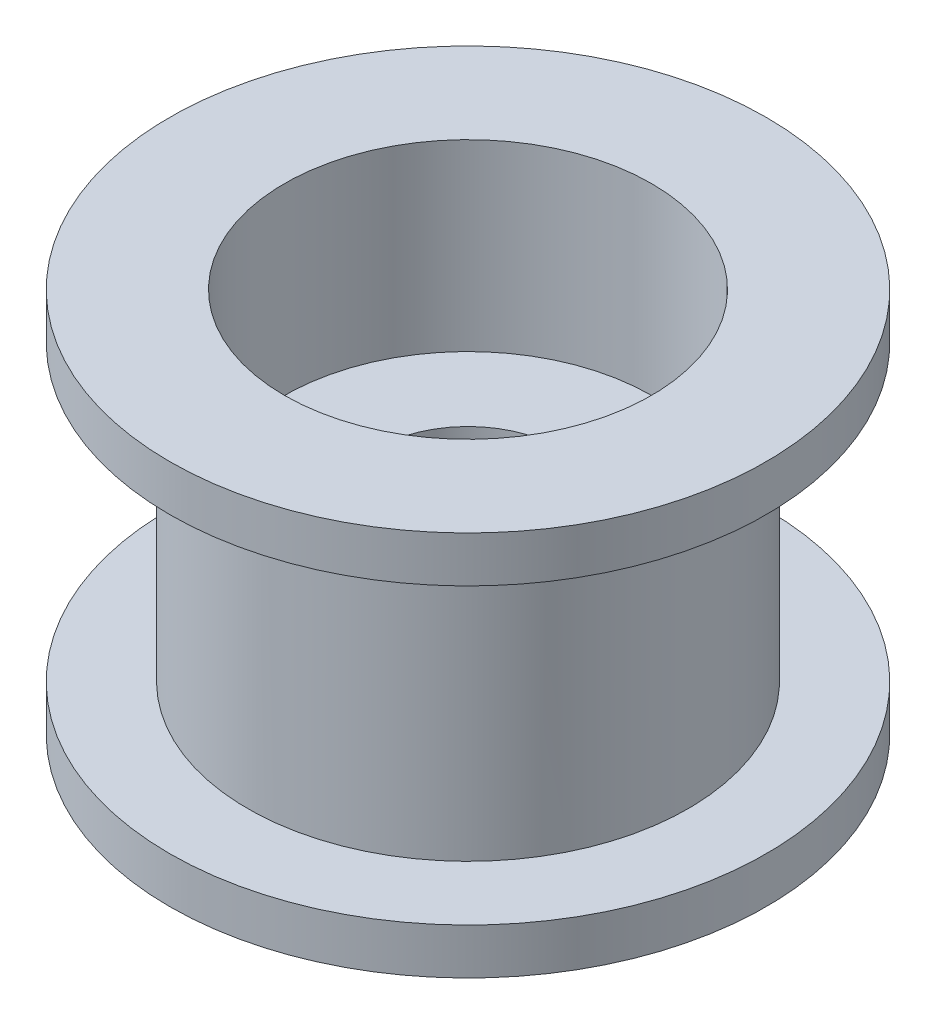
ISO-10303-21;
HEADER;
FILE_DESCRIPTION(('STEP AP214'),'2;1');
FILE_NAME('part.step','',(''),(''),'','','');
FILE_SCHEMA(('AUTOMOTIVE_DESIGN { 1 0 10303 214 1 1 1 1 }'));
ENDSEC;
DATA;
#1=APPLICATION_CONTEXT('core data for automotive mechanical design processes');
#2=APPLICATION_PROTOCOL_DEFINITION('international standard','automotive_design',2000,#1);
#3=PRODUCT_CONTEXT('',#1,'mechanical');
#4=PRODUCT('Part','Part','',(#3));
#5=PRODUCT_RELATED_PRODUCT_CATEGORY('part','',(#4));
#6=PRODUCT_DEFINITION_FORMATION('','',#4);
#7=PRODUCT_DEFINITION_CONTEXT('part definition',#1,'design');
#8=PRODUCT_DEFINITION('design','',#6,#7);
#9=PRODUCT_DEFINITION_SHAPE('','',#8);
#10=(LENGTH_UNIT() NAMED_UNIT(*) SI_UNIT(.MILLI.,.METRE.));
#11=(NAMED_UNIT(*) PLANE_ANGLE_UNIT() SI_UNIT($,.RADIAN.));
#12=(NAMED_UNIT(*) SI_UNIT($,.STERADIAN.) SOLID_ANGLE_UNIT());
#13=UNCERTAINTY_MEASURE_WITH_UNIT(LENGTH_MEASURE(1.E-05),#10,'distance_accuracy_value','');
#14=(GEOMETRIC_REPRESENTATION_CONTEXT(3) GLOBAL_UNCERTAINTY_ASSIGNED_CONTEXT((#13)) GLOBAL_UNIT_ASSIGNED_CONTEXT((#10,
#11,#12)) REPRESENTATION_CONTEXT('',''));
#15=CARTESIAN_POINT('',(0.,0.,0.));
#16=DIRECTION('',(0.,0.,1.));
#17=DIRECTION('',(1.,0.,0.));
#18=AXIS2_PLACEMENT_3D('',#15,#16,#17);
#19=CARTESIAN_POINT('',(0.,-4.2,0.));
#20=DIRECTION('',(0.,-1.,0.));
#21=DIRECTION('',(0.,0.,1.));
#22=AXIS2_PLACEMENT_3D('',#19,#20,#21);
#23=PLANE('',#22);
#24=CARTESIAN_POINT('',(0.,-4.2,0.));
#25=DIRECTION('',(0.,1.,0.));
#26=DIRECTION('',(0.,0.,1.));
#27=AXIS2_PLACEMENT_3D('',#24,#25,#26);
#28=CIRCLE('',#27,6.5);
#29=CARTESIAN_POINT('',(0.,-4.2,6.5));
#30=VERTEX_POINT('',#29);
#31=EDGE_CURVE('E58',#30,#30,#28,.T.);
#32=ORIENTED_EDGE('',*,*,#31,.F.);
#33=EDGE_LOOP('',(#32));
#34=FACE_BOUND('',#33,.T.);
#35=CARTESIAN_POINT('',(0.,-4.2,0.));
#36=DIRECTION('',(0.,1.,0.));
#37=DIRECTION('',(0.,0.,1.));
#38=AXIS2_PLACEMENT_3D('',#35,#36,#37);
#39=CIRCLE('',#38,4.);
#40=CARTESIAN_POINT('',(0.,-4.2,4.));
#41=VERTEX_POINT('',#40);
#42=EDGE_CURVE('E65',#41,#41,#39,.T.);
#43=ORIENTED_EDGE('',*,*,#42,.T.);
#44=EDGE_LOOP('',(#43));
#45=FACE_BOUND('',#44,.T.);
#46=ADVANCED_FACE('F32',(#34,#45),#23,.T.);
#47=CARTESIAN_POINT('',(0.,3.2,0.));
#48=DIRECTION('',(0.,-1.,0.));
#49=DIRECTION('',(0.,0.,-1.));
#50=AXIS2_PLACEMENT_3D('',#47,#48,#49);
#51=CYLINDRICAL_SURFACE('',#50,4.8);
#52=CARTESIAN_POINT('',(0.,3.2,0.));
#53=DIRECTION('',(0.,1.,0.));
#54=DIRECTION('',(0.,0.,1.));
#55=AXIS2_PLACEMENT_3D('',#52,#53,#54);
#56=CIRCLE('',#55,4.8);
#57=CARTESIAN_POINT('',(0.,3.2,4.8));
#58=VERTEX_POINT('',#57);
#59=EDGE_CURVE('E10',#58,#58,#56,.T.);
#60=ORIENTED_EDGE('',*,*,#59,.F.);
#61=EDGE_LOOP('',(#60));
#62=FACE_BOUND('',#61,.T.);
#63=CARTESIAN_POINT('',(0.,-3.2,0.));
#64=DIRECTION('',(0.,-1.,0.));
#65=DIRECTION('',(0.,0.,-1.));
#66=AXIS2_PLACEMENT_3D('',#63,#64,#65);
#67=CIRCLE('',#66,4.8);
#68=CARTESIAN_POINT('',(0.,-3.2,-4.8));
#69=VERTEX_POINT('',#68);
#70=EDGE_CURVE('E53',#69,#69,#67,.T.);
#71=ORIENTED_EDGE('',*,*,#70,.F.);
#72=EDGE_LOOP('',(#71));
#73=FACE_BOUND('',#72,.T.);
#74=ADVANCED_FACE('F34',(#62,#73),#51,.T.);
#75=CARTESIAN_POINT('',(0.,3.2,0.));
#76=DIRECTION('',(0.,1.,0.));
#77=DIRECTION('',(0.,0.,1.));
#78=AXIS2_PLACEMENT_3D('',#75,#76,#77);
#79=PLANE('',#78);
#80=CARTESIAN_POINT('',(0.,3.2,0.));
#81=DIRECTION('',(0.,1.,0.));
#82=DIRECTION('',(0.,0.,1.));
#83=AXIS2_PLACEMENT_3D('',#80,#81,#82);
#84=CIRCLE('',#83,6.5);
#85=CARTESIAN_POINT('',(0.,3.2,6.5));
#86=VERTEX_POINT('',#85);
#87=EDGE_CURVE('E44',#86,#86,#84,.T.);
#88=ORIENTED_EDGE('',*,*,#87,.F.);
#89=EDGE_LOOP('',(#88));
#90=FACE_BOUND('',#89,.T.);
#91=ORIENTED_EDGE('',*,*,#59,.T.);
#92=EDGE_LOOP('',(#91));
#93=FACE_BOUND('',#92,.T.);
#94=ADVANCED_FACE('F98',(#90,#93),#79,.F.);
#95=CARTESIAN_POINT('',(0.,4.2,0.));
#96=DIRECTION('',(0.,-1.,0.));
#97=DIRECTION('',(0.,0.,-1.));
#98=AXIS2_PLACEMENT_3D('',#95,#96,#97);
#99=CYLINDRICAL_SURFACE('',#98,6.5);
#100=CARTESIAN_POINT('',(0.,4.2,0.));
#101=DIRECTION('',(0.,1.,0.));
#102=DIRECTION('',(0.,0.,1.));
#103=AXIS2_PLACEMENT_3D('',#100,#101,#102);
#104=CIRCLE('',#103,6.5);
#105=CARTESIAN_POINT('',(0.,4.2,6.5));
#106=VERTEX_POINT('',#105);
#107=EDGE_CURVE('E40',#106,#106,#104,.T.);
#108=ORIENTED_EDGE('',*,*,#107,.F.);
#109=EDGE_LOOP('',(#108));
#110=FACE_BOUND('',#109,.T.);
#111=ORIENTED_EDGE('',*,*,#87,.T.);
#112=EDGE_LOOP('',(#111));
#113=FACE_BOUND('',#112,.T.);
#114=ADVANCED_FACE('F120',(#110,#113),#99,.T.);
#115=CARTESIAN_POINT('',(0.,4.2,0.));
#116=DIRECTION('',(0.,1.,0.));
#117=DIRECTION('',(0.,0.,1.));
#118=AXIS2_PLACEMENT_3D('',#115,#116,#117);
#119=PLANE('',#118);
#120=CARTESIAN_POINT('',(0.,4.2,0.));
#121=DIRECTION('',(0.,1.,0.));
#122=DIRECTION('',(0.,0.,1.));
#123=AXIS2_PLACEMENT_3D('',#120,#121,#122);
#124=CIRCLE('',#123,4.);
#125=CARTESIAN_POINT('',(0.,4.2,4.));
#126=VERTEX_POINT('',#125);
#127=EDGE_CURVE('E50',#126,#126,#124,.T.);
#128=ORIENTED_EDGE('',*,*,#127,.F.);
#129=EDGE_LOOP('',(#128));
#130=FACE_BOUND('',#129,.T.);
#131=ORIENTED_EDGE('',*,*,#107,.T.);
#132=EDGE_LOOP('',(#131));
#133=FACE_BOUND('',#132,.T.);
#134=ADVANCED_FACE('F116',(#130,#133),#119,.T.);
#135=CARTESIAN_POINT('',(0.,0.200000000000001,0.));
#136=DIRECTION('',(0.,1.,0.));
#137=DIRECTION('',(0.,0.,1.));
#138=AXIS2_PLACEMENT_3D('',#135,#136,#137);
#139=CYLINDRICAL_SURFACE('',#138,4.);
#140=CARTESIAN_POINT('',(0.,0.200000000000001,0.));
#141=DIRECTION('',(0.,1.,0.));
#142=DIRECTION('',(0.,0.,1.));
#143=AXIS2_PLACEMENT_3D('',#140,#141,#142);
#144=CIRCLE('',#143,4.);
#145=CARTESIAN_POINT('',(0.,0.200000000000001,4.));
#146=VERTEX_POINT('',#145);
#147=EDGE_CURVE('E48',#146,#146,#144,.T.);
#148=ORIENTED_EDGE('',*,*,#147,.F.);
#149=EDGE_LOOP('',(#148));
#150=FACE_BOUND('',#149,.T.);
#151=ORIENTED_EDGE('',*,*,#127,.T.);
#152=EDGE_LOOP('',(#151));
#153=FACE_BOUND('',#152,.T.);
#154=ADVANCED_FACE('F112',(#150,#153),#139,.F.);
#155=CARTESIAN_POINT('',(0.,0.200000000000001,0.));
#156=DIRECTION('',(0.,1.,0.));
#157=DIRECTION('',(0.,0.,1.));
#158=AXIS2_PLACEMENT_3D('',#155,#156,#157);
#159=PLANE('',#158);
#160=CARTESIAN_POINT('',(0.,0.200000000000001,0.));
#161=DIRECTION('',(0.,1.,0.));
#162=DIRECTION('',(0.,0.,1.));
#163=AXIS2_PLACEMENT_3D('',#160,#161,#162);
#164=CIRCLE('',#163,2.);
#165=CARTESIAN_POINT('',(0.,0.200000000000001,2.));
#166=VERTEX_POINT('',#165);
#167=EDGE_CURVE('E70',#166,#166,#164,.T.);
#168=ORIENTED_EDGE('',*,*,#167,.F.);
#169=EDGE_LOOP('',(#168));
#170=FACE_BOUND('',#169,.T.);
#171=ORIENTED_EDGE('',*,*,#147,.T.);
#172=EDGE_LOOP('',(#171));
#173=FACE_BOUND('',#172,.T.);
#174=ADVANCED_FACE('F105',(#170,#173),#159,.T.);
#175=CARTESIAN_POINT('',(0.,-3.2,0.));
#176=DIRECTION('',(0.,-1.,0.));
#177=DIRECTION('',(0.,0.,1.));
#178=AXIS2_PLACEMENT_3D('',#175,#176,#177);
#179=PLANE('',#178);
#180=CARTESIAN_POINT('',(0.,-3.2,0.));
#181=DIRECTION('',(0.,1.,0.));
#182=DIRECTION('',(0.,0.,1.));
#183=AXIS2_PLACEMENT_3D('',#180,#181,#182);
#184=CIRCLE('',#183,6.5);
#185=CARTESIAN_POINT('',(0.,-3.2,6.5));
#186=VERTEX_POINT('',#185);
#187=EDGE_CURVE('E59',#186,#186,#184,.T.);
#188=ORIENTED_EDGE('',*,*,#187,.T.);
#189=EDGE_LOOP('',(#188));
#190=FACE_BOUND('',#189,.T.);
#191=ORIENTED_EDGE('',*,*,#70,.T.);
#192=EDGE_LOOP('',(#191));
#193=FACE_BOUND('',#192,.T.);
#194=ADVANCED_FACE('F102',(#190,#193),#179,.F.);
#195=CARTESIAN_POINT('',(0.,-4.2,0.));
#196=DIRECTION('',(0.,1.,0.));
#197=DIRECTION('',(0.,0.,1.));
#198=AXIS2_PLACEMENT_3D('',#195,#196,#197);
#199=CYLINDRICAL_SURFACE('',#198,6.5);
#200=ORIENTED_EDGE('',*,*,#31,.T.);
#201=EDGE_LOOP('',(#200));
#202=FACE_BOUND('',#201,.T.);
#203=ORIENTED_EDGE('',*,*,#187,.F.);
#204=EDGE_LOOP('',(#203));
#205=FACE_BOUND('',#204,.T.);
#206=ADVANCED_FACE('F88',(#202,#205),#199,.T.);
#207=CARTESIAN_POINT('',(0.,-0.200000000000001,0.));
#208=DIRECTION('',(0.,-1.,0.));
#209=DIRECTION('',(0.,0.,-1.));
#210=AXIS2_PLACEMENT_3D('',#207,#208,#209);
#211=CYLINDRICAL_SURFACE('',#210,4.);
#212=CARTESIAN_POINT('',(0.,-0.200000000000001,0.));
#213=DIRECTION('',(0.,1.,0.));
#214=DIRECTION('',(0.,0.,1.));
#215=AXIS2_PLACEMENT_3D('',#212,#213,#214);
#216=CIRCLE('',#215,4.);
#217=CARTESIAN_POINT('',(0.,-0.200000000000001,4.));
#218=VERTEX_POINT('',#217);
#219=EDGE_CURVE('E62',#218,#218,#216,.T.);
#220=ORIENTED_EDGE('',*,*,#219,.T.);
#221=EDGE_LOOP('',(#220));
#222=FACE_BOUND('',#221,.T.);
#223=ORIENTED_EDGE('',*,*,#42,.F.);
#224=EDGE_LOOP('',(#223));
#225=FACE_BOUND('',#224,.T.);
#226=ADVANCED_FACE('F82',(#222,#225),#211,.F.);
#227=CARTESIAN_POINT('',(0.,-0.200000000000001,0.));
#228=DIRECTION('',(0.,-1.,0.));
#229=DIRECTION('',(0.,0.,1.));
#230=AXIS2_PLACEMENT_3D('',#227,#228,#229);
#231=PLANE('',#230);
#232=CARTESIAN_POINT('',(0.,-0.200000000000001,0.));
#233=DIRECTION('',(0.,-1.,0.));
#234=DIRECTION('',(0.,0.,-1.));
#235=AXIS2_PLACEMENT_3D('',#232,#233,#234);
#236=CIRCLE('',#235,2.);
#237=CARTESIAN_POINT('',(0.,-0.200000000000001,-2.));
#238=VERTEX_POINT('',#237);
#239=EDGE_CURVE('E36',#238,#238,#236,.T.);
#240=ORIENTED_EDGE('',*,*,#239,.F.);
#241=EDGE_LOOP('',(#240));
#242=FACE_BOUND('',#241,.T.);
#243=ORIENTED_EDGE('',*,*,#219,.F.);
#244=EDGE_LOOP('',(#243));
#245=FACE_BOUND('',#244,.T.);
#246=ADVANCED_FACE('F79',(#242,#245),#231,.T.);
#247=CARTESIAN_POINT('',(0.,-4.2,0.));
#248=DIRECTION('',(0.,1.,0.));
#249=DIRECTION('',(0.,0.,1.));
#250=AXIS2_PLACEMENT_3D('',#247,#248,#249);
#251=CYLINDRICAL_SURFACE('',#250,2.);
#252=ORIENTED_EDGE('',*,*,#239,.T.);
#253=EDGE_LOOP('',(#252));
#254=FACE_BOUND('',#253,.T.);
#255=ORIENTED_EDGE('',*,*,#167,.T.);
#256=EDGE_LOOP('',(#255));
#257=FACE_BOUND('',#256,.T.);
#258=ADVANCED_FACE('F77',(#254,#257),#251,.F.);
#259=CLOSED_SHELL('',(#46,#74,#94,#114,#134,#154,#174,#194,#206,#226,#246,#258));
#260=MANIFOLD_SOLID_BREP('B2',#259);
#261=ADVANCED_BREP_SHAPE_REPRESENTATION('',(#18,#260),#14);
#262=SHAPE_DEFINITION_REPRESENTATION(#9,#261);
ENDSEC;
END-ISO-10303-21;
